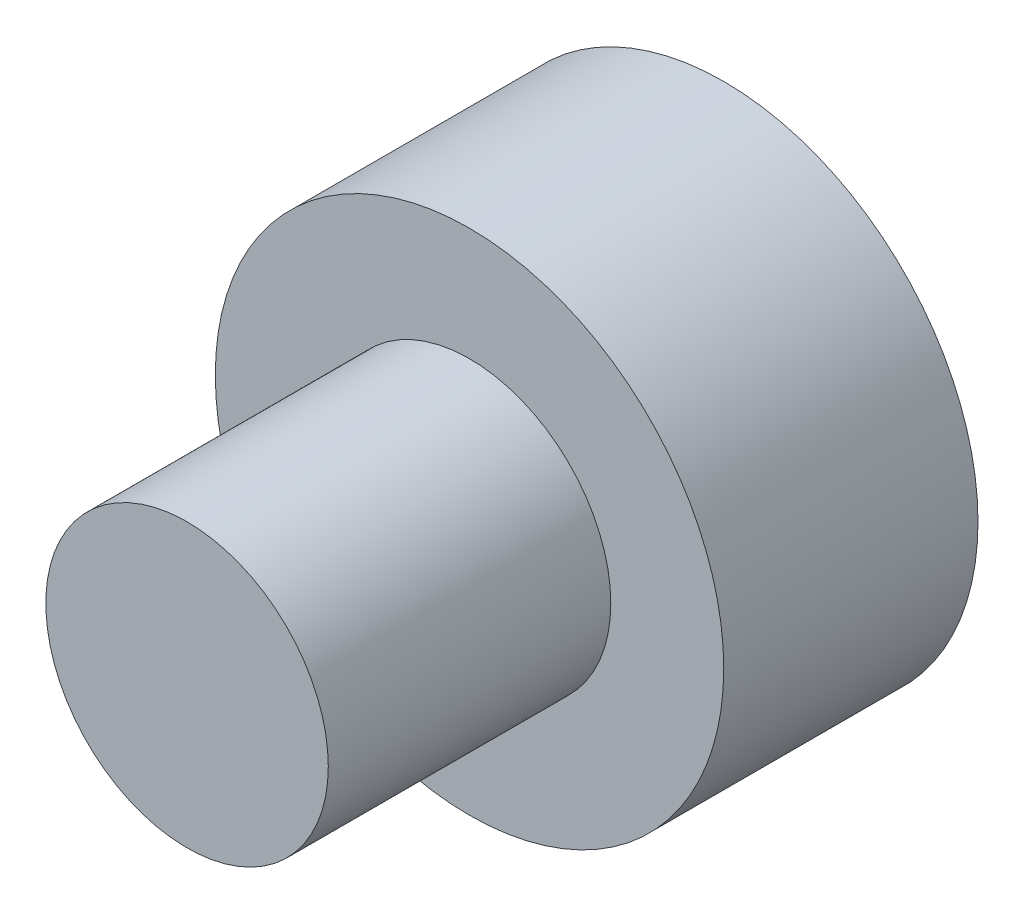
ISO-10303-21;
HEADER;
FILE_DESCRIPTION(('STEP AP214'),'2;1');
FILE_NAME('part.step','',(''),(''),'','','');
FILE_SCHEMA(('AUTOMOTIVE_DESIGN { 1 0 10303 214 1 1 1 1 }'));
ENDSEC;
DATA;
#1=APPLICATION_CONTEXT('core data for automotive mechanical design processes');
#2=APPLICATION_PROTOCOL_DEFINITION('international standard','automotive_design',2000,#1);
#3=PRODUCT_CONTEXT('',#1,'mechanical');
#4=PRODUCT('Part','Part','',(#3));
#5=PRODUCT_RELATED_PRODUCT_CATEGORY('part','',(#4));
#6=PRODUCT_DEFINITION_FORMATION('','',#4);
#7=PRODUCT_DEFINITION_CONTEXT('part definition',#1,'design');
#8=PRODUCT_DEFINITION('design','',#6,#7);
#9=PRODUCT_DEFINITION_SHAPE('','',#8);
#10=(LENGTH_UNIT() NAMED_UNIT(*) SI_UNIT(.MILLI.,.METRE.));
#11=(NAMED_UNIT(*) PLANE_ANGLE_UNIT() SI_UNIT($,.RADIAN.));
#12=(NAMED_UNIT(*) SI_UNIT($,.STERADIAN.) SOLID_ANGLE_UNIT());
#13=UNCERTAINTY_MEASURE_WITH_UNIT(LENGTH_MEASURE(1.E-05),#10,'distance_accuracy_value','');
#14=(GEOMETRIC_REPRESENTATION_CONTEXT(3) GLOBAL_UNCERTAINTY_ASSIGNED_CONTEXT((#13)) GLOBAL_UNIT_ASSIGNED_CONTEXT((#10,
#11,#12)) REPRESENTATION_CONTEXT('',''));
#15=CARTESIAN_POINT('',(0.,0.,0.));
#16=DIRECTION('',(0.,0.,1.));
#17=DIRECTION('',(1.,0.,0.));
#18=AXIS2_PLACEMENT_3D('',#15,#16,#17);
#19=CARTESIAN_POINT('',(0.,0.,4.5));
#20=DIRECTION('',(0.,0.,-1.));
#21=DIRECTION('',(-1.,0.,0.));
#22=AXIS2_PLACEMENT_3D('',#19,#20,#21);
#23=CYLINDRICAL_SURFACE('',#22,4.5);
#24=CARTESIAN_POINT('',(0.,0.,4.5));
#25=DIRECTION('',(0.,0.,1.));
#26=DIRECTION('',(1.,0.,0.));
#27=AXIS2_PLACEMENT_3D('',#24,#25,#26);
#28=CIRCLE('',#27,4.5);
#29=CARTESIAN_POINT('',(4.5,0.,4.5));
#30=VERTEX_POINT('',#29);
#31=EDGE_CURVE('E54',#30,#30,#28,.T.);
#32=ORIENTED_EDGE('',*,*,#31,.F.);
#33=EDGE_LOOP('',(#32));
#34=FACE_BOUND('',#33,.T.);
#35=CARTESIAN_POINT('',(0.,0.,0.));
#36=DIRECTION('',(0.,0.,1.));
#37=DIRECTION('',(1.,0.,0.));
#38=AXIS2_PLACEMENT_3D('',#35,#36,#37);
#39=CIRCLE('',#38,4.5);
#40=CARTESIAN_POINT('',(4.5,0.,0.));
#41=VERTEX_POINT('',#40);
#42=EDGE_CURVE('E48',#41,#41,#39,.T.);
#43=ORIENTED_EDGE('',*,*,#42,.T.);
#44=EDGE_LOOP('',(#43));
#45=FACE_BOUND('',#44,.T.);
#46=ADVANCED_FACE('F45',(#34,#45),#23,.T.);
#47=CARTESIAN_POINT('',(0.,0.,4.5));
#48=DIRECTION('',(0.,0.,1.));
#49=DIRECTION('',(1.,0.,0.));
#50=AXIS2_PLACEMENT_3D('',#47,#48,#49);
#51=PLANE('',#50);
#52=CARTESIAN_POINT('',(0.,0.,4.5));
#53=DIRECTION('',(0.,0.,1.));
#54=DIRECTION('',(1.,0.,0.));
#55=AXIS2_PLACEMENT_3D('',#52,#53,#54);
#56=CIRCLE('',#55,2.5);
#57=CARTESIAN_POINT('',(2.5,0.,4.5));
#58=VERTEX_POINT('',#57);
#59=EDGE_CURVE('E11',#58,#58,#56,.T.);
#60=ORIENTED_EDGE('',*,*,#59,.F.);
#61=EDGE_LOOP('',(#60));
#62=FACE_BOUND('',#61,.T.);
#63=ORIENTED_EDGE('',*,*,#31,.T.);
#64=EDGE_LOOP('',(#63));
#65=FACE_BOUND('',#64,.T.);
#66=ADVANCED_FACE('F182',(#62,#65),#51,.T.);
#67=CARTESIAN_POINT('',(0.,0.,0.));
#68=DIRECTION('',(0.,0.,1.));
#69=DIRECTION('',(1.,0.,0.));
#70=AXIS2_PLACEMENT_3D('',#67,#68,#69);
#71=PLANE('',#70);
#72=DIRECTION('',(0.525642647284615,0.850705476269915,0.));
#73=VECTOR('',#72,1.);
#74=CARTESIAN_POINT('',(-3.15032897639804,0.0941333359481752,0.));
#75=LINE('',#74,#73);
#76=CARTESIAN_POINT('',(-3.15032897639804,0.0941333359481752,0.));
#77=VERTEX_POINT('',#76);
#78=CARTESIAN_POINT('',(-1.49364262792492,2.77533159181302,0.));
#79=VERTEX_POINT('',#78);
#80=EDGE_CURVE('E142',#77,#79,#75,.T.);
#81=ORIENTED_EDGE('',*,*,#80,.F.);
#82=DIRECTION('',(-0.473911229945979,0.880572623995937,0.));
#83=VECTOR('',#82,1.);
#84=CARTESIAN_POINT('',(-1.65668634847311,-2.68119825586484,0.));
#85=LINE('',#84,#83);
#86=CARTESIAN_POINT('',(-1.65668634847311,-2.68119825586484,0.));
#87=VERTEX_POINT('',#86);
#88=EDGE_CURVE('E62',#87,#77,#85,.T.);
#89=ORIENTED_EDGE('',*,*,#88,.F.);
#90=DIRECTION('',(-0.999553877230593,0.0298671477260224,0.));
#91=VECTOR('',#90,1.);
#92=CARTESIAN_POINT('',(1.49364262792492,-2.77533159181302,0.));
#93=LINE('',#92,#91);
#94=CARTESIAN_POINT('',(1.49364262792492,-2.77533159181302,0.));
#95=VERTEX_POINT('',#94);
#96=EDGE_CURVE('E156',#95,#87,#93,.T.);
#97=ORIENTED_EDGE('',*,*,#96,.F.);
#98=DIRECTION('',(-0.525642647284615,-0.850705476269915,0.));
#99=VECTOR('',#98,1.);
#100=CARTESIAN_POINT('',(3.15032897639804,-0.0941333359481757,0.));
#101=LINE('',#100,#99);
#102=CARTESIAN_POINT('',(3.15032897639804,-0.0941333359481757,0.));
#103=VERTEX_POINT('',#102);
#104=EDGE_CURVE('E153',#103,#95,#101,.T.);
#105=ORIENTED_EDGE('',*,*,#104,.F.);
#106=DIRECTION('',(0.473911229945979,-0.880572623995937,0.));
#107=VECTOR('',#106,1.);
#108=CARTESIAN_POINT('',(1.65668634847311,2.68119825586484,0.));
#109=LINE('',#108,#107);
#110=CARTESIAN_POINT('',(1.65668634847311,2.68119825586484,0.));
#111=VERTEX_POINT('',#110);
#112=EDGE_CURVE('E110',#111,#103,#109,.T.);
#113=ORIENTED_EDGE('',*,*,#112,.F.);
#114=DIRECTION('',(0.999553877230593,-0.0298671477260222,0.));
#115=VECTOR('',#114,1.);
#116=CARTESIAN_POINT('',(-1.49364262792492,2.77533159181302,0.));
#117=LINE('',#116,#115);
#118=EDGE_CURVE('E147',#79,#111,#117,.T.);
#119=ORIENTED_EDGE('',*,*,#118,.F.);
#120=EDGE_LOOP('',(#81,#89,#97,#105,#113,#119));
#121=FACE_BOUND('',#120,.T.);
#122=ORIENTED_EDGE('',*,*,#42,.F.);
#123=EDGE_LOOP('',(#122));
#124=FACE_BOUND('',#123,.T.);
#125=ADVANCED_FACE('F179',(#121,#124),#71,.F.);
#126=CARTESIAN_POINT('',(-1.65668634847311,-2.68119825586484,2.));
#127=DIRECTION('',(-0.880572623995937,-0.473911229945979,0.));
#128=DIRECTION('',(0.473911229945979,-0.880572623995937,0.));
#129=AXIS2_PLACEMENT_3D('',#126,#127,#128);
#130=PLANE('',#129);
#131=ORIENTED_EDGE('',*,*,#88,.T.);
#132=DIRECTION('',(0.,0.,-1.));
#133=VECTOR('',#132,1.);
#134=CARTESIAN_POINT('',(-3.15032897639804,0.0941333359481752,2.));
#135=LINE('',#134,#133);
#136=CARTESIAN_POINT('',(-3.15032897639804,0.0941333359481752,2.));
#137=VERTEX_POINT('',#136);
#138=EDGE_CURVE('E92',#137,#77,#135,.T.);
#139=ORIENTED_EDGE('',*,*,#138,.F.);
#140=DIRECTION('',(-0.473911229945979,0.880572623995937,0.));
#141=VECTOR('',#140,1.);
#142=CARTESIAN_POINT('',(-1.65668634847311,-2.68119825586484,2.));
#143=LINE('',#142,#141);
#144=CARTESIAN_POINT('',(-1.65668634847311,-2.68119825586484,2.));
#145=VERTEX_POINT('',#144);
#146=EDGE_CURVE('E159',#145,#137,#143,.T.);
#147=ORIENTED_EDGE('',*,*,#146,.F.);
#148=DIRECTION('',(0.,0.,-1.));
#149=VECTOR('',#148,1.);
#150=CARTESIAN_POINT('',(-1.65668634847311,-2.68119825586484,2.));
#151=LINE('',#150,#149);
#152=EDGE_CURVE('E70',#145,#87,#151,.T.);
#153=ORIENTED_EDGE('',*,*,#152,.T.);
#154=EDGE_LOOP('',(#131,#139,#147,#153));
#155=FACE_BOUND('',#154,.T.);
#156=ADVANCED_FACE('F181',(#155),#130,.F.);
#157=CARTESIAN_POINT('',(1.49364262792492,-2.77533159181302,2.));
#158=DIRECTION('',(-0.0298671477260224,-0.999553877230593,0.));
#159=DIRECTION('',(0.999553877230593,-0.0298671477260224,0.));
#160=AXIS2_PLACEMENT_3D('',#157,#158,#159);
#161=PLANE('',#160);
#162=ORIENTED_EDGE('',*,*,#96,.T.);
#163=ORIENTED_EDGE('',*,*,#152,.F.);
#164=DIRECTION('',(-0.999553877230593,0.0298671477260224,0.));
#165=VECTOR('',#164,1.);
#166=CARTESIAN_POINT('',(1.49364262792492,-2.77533159181302,2.));
#167=LINE('',#166,#165);
#168=CARTESIAN_POINT('',(1.49364262792492,-2.77533159181302,2.));
#169=VERTEX_POINT('',#168);
#170=EDGE_CURVE('E124',#169,#145,#167,.T.);
#171=ORIENTED_EDGE('',*,*,#170,.F.);
#172=DIRECTION('',(0.,0.,-1.));
#173=VECTOR('',#172,1.);
#174=CARTESIAN_POINT('',(1.49364262792492,-2.77533159181302,2.));
#175=LINE('',#174,#173);
#176=EDGE_CURVE('E115',#169,#95,#175,.T.);
#177=ORIENTED_EDGE('',*,*,#176,.T.);
#178=EDGE_LOOP('',(#162,#163,#171,#177));
#179=FACE_BOUND('',#178,.T.);
#180=ADVANCED_FACE('F188',(#179),#161,.F.);
#181=CARTESIAN_POINT('',(3.15032897639804,-0.0941333359481757,2.));
#182=DIRECTION('',(0.850705476269915,-0.525642647284615,0.));
#183=DIRECTION('',(0.525642647284615,0.850705476269915,0.));
#184=AXIS2_PLACEMENT_3D('',#181,#182,#183);
#185=PLANE('',#184);
#186=ORIENTED_EDGE('',*,*,#104,.T.);
#187=ORIENTED_EDGE('',*,*,#176,.F.);
#188=DIRECTION('',(-0.525642647284615,-0.850705476269915,0.));
#189=VECTOR('',#188,1.);
#190=CARTESIAN_POINT('',(3.15032897639804,-0.0941333359481757,2.));
#191=LINE('',#190,#189);
#192=CARTESIAN_POINT('',(3.15032897639804,-0.0941333359481757,2.));
#193=VERTEX_POINT('',#192);
#194=EDGE_CURVE('E119',#193,#169,#191,.T.);
#195=ORIENTED_EDGE('',*,*,#194,.F.);
#196=DIRECTION('',(0.,0.,-1.));
#197=VECTOR('',#196,1.);
#198=CARTESIAN_POINT('',(3.15032897639804,-0.0941333359481757,2.));
#199=LINE('',#198,#197);
#200=EDGE_CURVE('E103',#193,#103,#199,.T.);
#201=ORIENTED_EDGE('',*,*,#200,.T.);
#202=EDGE_LOOP('',(#186,#187,#195,#201));
#203=FACE_BOUND('',#202,.T.);
#204=ADVANCED_FACE('F120',(#203),#185,.F.);
#205=CARTESIAN_POINT('',(1.65668634847311,2.68119825586484,2.));
#206=DIRECTION('',(0.880572623995937,0.473911229945979,0.));
#207=DIRECTION('',(-0.473911229945979,0.880572623995937,0.));
#208=AXIS2_PLACEMENT_3D('',#205,#206,#207);
#209=PLANE('',#208);
#210=ORIENTED_EDGE('',*,*,#112,.T.);
#211=ORIENTED_EDGE('',*,*,#200,.F.);
#212=DIRECTION('',(0.473911229945979,-0.880572623995937,0.));
#213=VECTOR('',#212,1.);
#214=CARTESIAN_POINT('',(1.65668634847311,2.68119825586484,2.));
#215=LINE('',#214,#213);
#216=CARTESIAN_POINT('',(1.65668634847311,2.68119825586484,2.));
#217=VERTEX_POINT('',#216);
#218=EDGE_CURVE('E107',#217,#193,#215,.T.);
#219=ORIENTED_EDGE('',*,*,#218,.F.);
#220=DIRECTION('',(0.,0.,-1.));
#221=VECTOR('',#220,1.);
#222=CARTESIAN_POINT('',(1.65668634847311,2.68119825586484,2.));
#223=LINE('',#222,#221);
#224=EDGE_CURVE('E116',#217,#111,#223,.T.);
#225=ORIENTED_EDGE('',*,*,#224,.T.);
#226=EDGE_LOOP('',(#210,#211,#219,#225));
#227=FACE_BOUND('',#226,.T.);
#228=ADVANCED_FACE('F105',(#227),#209,.F.);
#229=CARTESIAN_POINT('',(-1.49364262792492,2.77533159181302,2.));
#230=DIRECTION('',(0.0298671477260222,0.999553877230593,0.));
#231=DIRECTION('',(-0.999553877230593,0.0298671477260222,0.));
#232=AXIS2_PLACEMENT_3D('',#229,#230,#231);
#233=PLANE('',#232);
#234=ORIENTED_EDGE('',*,*,#118,.T.);
#235=ORIENTED_EDGE('',*,*,#224,.F.);
#236=DIRECTION('',(0.999553877230593,-0.0298671477260222,0.));
#237=VECTOR('',#236,1.);
#238=CARTESIAN_POINT('',(-1.49364262792492,2.77533159181302,2.));
#239=LINE('',#238,#237);
#240=CARTESIAN_POINT('',(-1.49364262792492,2.77533159181302,2.));
#241=VERTEX_POINT('',#240);
#242=EDGE_CURVE('E130',#241,#217,#239,.T.);
#243=ORIENTED_EDGE('',*,*,#242,.F.);
#244=DIRECTION('',(0.,0.,-1.));
#245=VECTOR('',#244,1.);
#246=CARTESIAN_POINT('',(-1.49364262792492,2.77533159181302,2.));
#247=LINE('',#246,#245);
#248=EDGE_CURVE('E166',#241,#79,#247,.T.);
#249=ORIENTED_EDGE('',*,*,#248,.T.);
#250=EDGE_LOOP('',(#234,#235,#243,#249));
#251=FACE_BOUND('',#250,.T.);
#252=ADVANCED_FACE('F241',(#251),#233,.F.);
#253=CARTESIAN_POINT('',(-3.15032897639804,0.0941333359481752,2.));
#254=DIRECTION('',(-0.850705476269915,0.525642647284615,0.));
#255=DIRECTION('',(-0.525642647284615,-0.850705476269915,0.));
#256=AXIS2_PLACEMENT_3D('',#253,#254,#255);
#257=PLANE('',#256);
#258=ORIENTED_EDGE('',*,*,#80,.T.);
#259=ORIENTED_EDGE('',*,*,#248,.F.);
#260=DIRECTION('',(0.525642647284615,0.850705476269915,0.));
#261=VECTOR('',#260,1.);
#262=CARTESIAN_POINT('',(-3.15032897639804,0.0941333359481752,2.));
#263=LINE('',#262,#261);
#264=EDGE_CURVE('E134',#137,#241,#263,.T.);
#265=ORIENTED_EDGE('',*,*,#264,.F.);
#266=ORIENTED_EDGE('',*,*,#138,.T.);
#267=EDGE_LOOP('',(#258,#259,#265,#266));
#268=FACE_BOUND('',#267,.T.);
#269=ADVANCED_FACE('F250',(#268),#257,.F.);
#270=CARTESIAN_POINT('',(0.,0.,2.));
#271=DIRECTION('',(0.,0.,-1.));
#272=DIRECTION('',(-1.,0.,0.));
#273=AXIS2_PLACEMENT_3D('',#270,#271,#272);
#274=PLANE('',#273);
#275=ORIENTED_EDGE('',*,*,#146,.T.);
#276=ORIENTED_EDGE('',*,*,#264,.T.);
#277=ORIENTED_EDGE('',*,*,#242,.T.);
#278=ORIENTED_EDGE('',*,*,#218,.T.);
#279=ORIENTED_EDGE('',*,*,#194,.T.);
#280=ORIENTED_EDGE('',*,*,#170,.T.);
#281=EDGE_LOOP('',(#275,#276,#277,#278,#279,#280));
#282=FACE_BOUND('',#281,.T.);
#283=ADVANCED_FACE('F127',(#282),#274,.T.);
#284=CARTESIAN_POINT('',(0.,0.,9.5));
#285=DIRECTION('',(0.,0.,-1.));
#286=DIRECTION('',(-1.,0.,0.));
#287=AXIS2_PLACEMENT_3D('',#284,#285,#286);
#288=CYLINDRICAL_SURFACE('',#287,2.5);
#289=CARTESIAN_POINT('',(0.,0.,9.5));
#290=DIRECTION('',(0.,0.,1.));
#291=DIRECTION('',(1.,0.,0.));
#292=AXIS2_PLACEMENT_3D('',#289,#290,#291);
#293=CIRCLE('',#292,2.5);
#294=CARTESIAN_POINT('',(2.5,0.,9.5));
#295=VERTEX_POINT('',#294);
#296=EDGE_CURVE('E143',#295,#295,#293,.T.);
#297=ORIENTED_EDGE('',*,*,#296,.F.);
#298=EDGE_LOOP('',(#297));
#299=FACE_BOUND('',#298,.T.);
#300=ORIENTED_EDGE('',*,*,#59,.T.);
#301=EDGE_LOOP('',(#300));
#302=FACE_BOUND('',#301,.T.);
#303=ADVANCED_FACE('F268',(#299,#302),#288,.T.);
#304=CARTESIAN_POINT('',(0.,0.,9.5));
#305=DIRECTION('',(0.,0.,1.));
#306=DIRECTION('',(1.,0.,0.));
#307=AXIS2_PLACEMENT_3D('',#304,#305,#306);
#308=PLANE('',#307);
#309=ORIENTED_EDGE('',*,*,#296,.T.);
#310=EDGE_LOOP('',(#309));
#311=FACE_BOUND('',#310,.T.);
#312=ADVANCED_FACE('F276',(#311),#308,.T.);
#313=CLOSED_SHELL('',(#46,#66,#125,#156,#180,#204,#228,#252,#269,#283,#303,#312));
#314=MANIFOLD_SOLID_BREP('B2',#313);
#315=ADVANCED_BREP_SHAPE_REPRESENTATION('',(#18,#314),#14);
#316=SHAPE_DEFINITION_REPRESENTATION(#9,#315);
ENDSEC;
END-ISO-10303-21;
